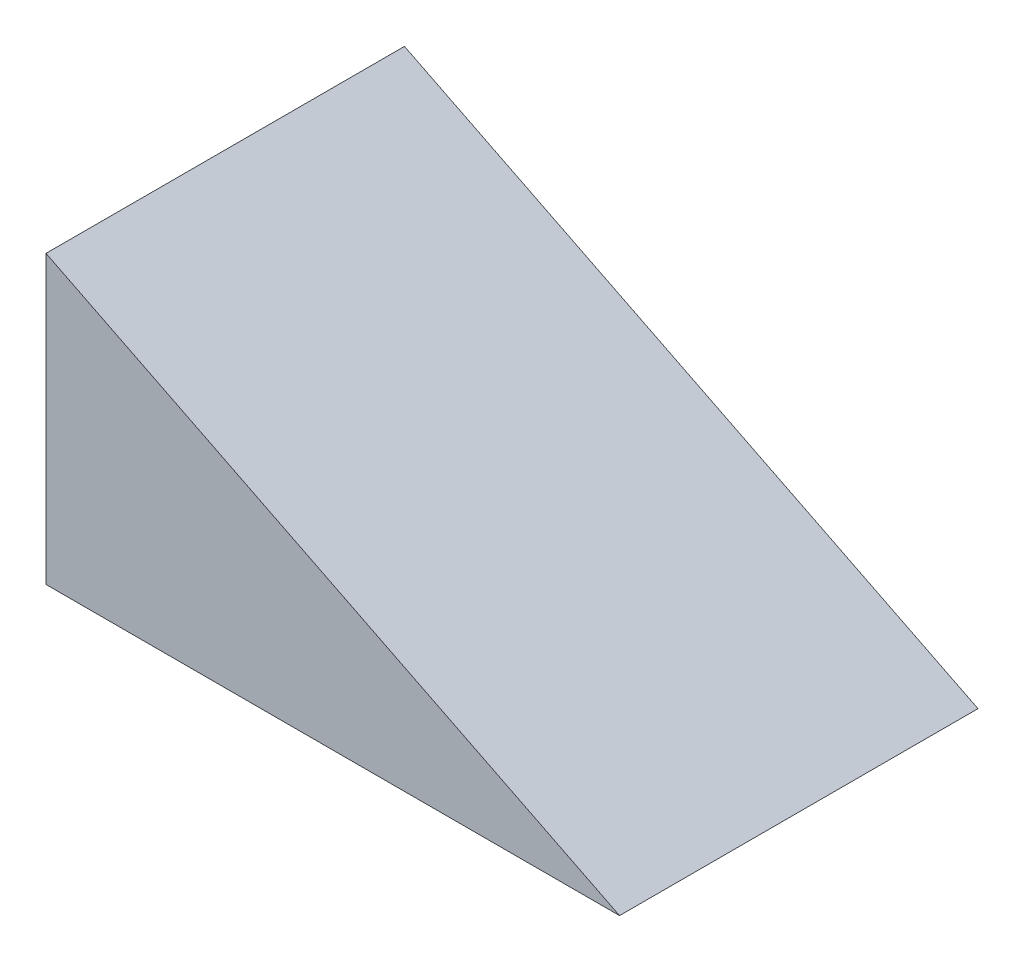
ISO-10303-21;
HEADER;
FILE_DESCRIPTION(('STEP AP214'),'2;1');
FILE_NAME('part.step','',(''),(''),'','','');
FILE_SCHEMA(('AUTOMOTIVE_DESIGN { 1 0 10303 214 1 1 1 1 }'));
ENDSEC;
DATA;
#1=APPLICATION_CONTEXT('core data for automotive mechanical design processes');
#2=APPLICATION_PROTOCOL_DEFINITION('international standard','automotive_design',2000,#1);
#3=PRODUCT_CONTEXT('',#1,'mechanical');
#4=PRODUCT('Part','Part','',(#3));
#5=PRODUCT_RELATED_PRODUCT_CATEGORY('part','',(#4));
#6=PRODUCT_DEFINITION_FORMATION('','',#4);
#7=PRODUCT_DEFINITION_CONTEXT('part definition',#1,'design');
#8=PRODUCT_DEFINITION('design','',#6,#7);
#9=PRODUCT_DEFINITION_SHAPE('','',#8);
#10=(LENGTH_UNIT() NAMED_UNIT(*) SI_UNIT(.MILLI.,.METRE.));
#11=(NAMED_UNIT(*) PLANE_ANGLE_UNIT() SI_UNIT($,.RADIAN.));
#12=(NAMED_UNIT(*) SI_UNIT($,.STERADIAN.) SOLID_ANGLE_UNIT());
#13=UNCERTAINTY_MEASURE_WITH_UNIT(LENGTH_MEASURE(1.E-05),#10,'distance_accuracy_value','');
#14=(GEOMETRIC_REPRESENTATION_CONTEXT(3) GLOBAL_UNCERTAINTY_ASSIGNED_CONTEXT((#13)) GLOBAL_UNIT_ASSIGNED_CONTEXT((#10,
#11,#12)) REPRESENTATION_CONTEXT('',''));
#15=CARTESIAN_POINT('',(0.,0.,0.));
#16=DIRECTION('',(0.,0.,1.));
#17=DIRECTION('',(1.,0.,0.));
#18=AXIS2_PLACEMENT_3D('',#15,#16,#17);
#19=CARTESIAN_POINT('',(40.64,81.28,127.));
#20=DIRECTION('',(0.447213595499958,0.894427190999916,0.));
#21=DIRECTION('',(-0.894427190999916,0.447213595499958,0.));
#22=AXIS2_PLACEMENT_3D('',#19,#20,#21);
#23=PLANE('',#22);
#24=DIRECTION('',(0.894427190999916,-0.447213595499958,0.));
#25=VECTOR('',#24,1.);
#26=CARTESIAN_POINT('',(40.64,81.28,0.));
#27=LINE('',#26,#25);
#28=CARTESIAN_POINT('',(0.,101.6,0.));
#29=VERTEX_POINT('',#28);
#30=CARTESIAN_POINT('',(203.2,0.,0.));
#31=VERTEX_POINT('',#30);
#32=EDGE_CURVE('E72',#29,#31,#27,.T.);
#33=ORIENTED_EDGE('',*,*,#32,.F.);
#34=DIRECTION('',(0.,0.,-1.));
#35=VECTOR('',#34,1.);
#36=CARTESIAN_POINT('',(0.,101.6,127.));
#37=LINE('',#36,#35);
#38=CARTESIAN_POINT('',(0.,101.6,127.));
#39=VERTEX_POINT('',#38);
#40=EDGE_CURVE('E11',#39,#29,#37,.T.);
#41=ORIENTED_EDGE('',*,*,#40,.F.);
#42=DIRECTION('',(0.894427190999916,-0.447213595499958,0.));
#43=VECTOR('',#42,1.);
#44=CARTESIAN_POINT('',(40.64,81.28,127.));
#45=LINE('',#44,#43);
#46=CARTESIAN_POINT('',(203.2,0.,127.));
#47=VERTEX_POINT('',#46);
#48=EDGE_CURVE('E70',#39,#47,#45,.T.);
#49=ORIENTED_EDGE('',*,*,#48,.T.);
#50=DIRECTION('',(0.,0.,-1.));
#51=VECTOR('',#50,1.);
#52=CARTESIAN_POINT('',(203.2,0.,127.));
#53=LINE('',#52,#51);
#54=EDGE_CURVE('E68',#47,#31,#53,.T.);
#55=ORIENTED_EDGE('',*,*,#54,.T.);
#56=EDGE_LOOP('',(#33,#41,#49,#55));
#57=FACE_BOUND('',#56,.T.);
#58=ADVANCED_FACE('F35',(#57),#23,.T.);
#59=CARTESIAN_POINT('',(0.,0.,127.));
#60=DIRECTION('',(-1.,0.,0.));
#61=DIRECTION('',(0.,0.,1.));
#62=AXIS2_PLACEMENT_3D('',#59,#60,#61);
#63=PLANE('',#62);
#64=DIRECTION('',(0.,1.,0.));
#65=VECTOR('',#64,1.);
#66=CARTESIAN_POINT('',(0.,0.,0.));
#67=LINE('',#66,#65);
#68=CARTESIAN_POINT('',(0.,0.,0.));
#69=VERTEX_POINT('',#68);
#70=EDGE_CURVE('E86',#69,#29,#67,.T.);
#71=ORIENTED_EDGE('',*,*,#70,.F.);
#72=DIRECTION('',(0.,0.,-1.));
#73=VECTOR('',#72,1.);
#74=CARTESIAN_POINT('',(0.,0.,127.));
#75=LINE('',#74,#73);
#76=CARTESIAN_POINT('',(0.,0.,127.));
#77=VERTEX_POINT('',#76);
#78=EDGE_CURVE('E43',#77,#69,#75,.T.);
#79=ORIENTED_EDGE('',*,*,#78,.F.);
#80=DIRECTION('',(0.,1.,0.));
#81=VECTOR('',#80,1.);
#82=CARTESIAN_POINT('',(0.,0.,127.));
#83=LINE('',#82,#81);
#84=EDGE_CURVE('E78',#77,#39,#83,.T.);
#85=ORIENTED_EDGE('',*,*,#84,.T.);
#86=ORIENTED_EDGE('',*,*,#40,.T.);
#87=EDGE_LOOP('',(#71,#79,#85,#86));
#88=FACE_BOUND('',#87,.T.);
#89=ADVANCED_FACE('F81',(#88),#63,.T.);
#90=CARTESIAN_POINT('',(0.,0.,127.));
#91=DIRECTION('',(0.,1.,0.));
#92=DIRECTION('',(0.,0.,1.));
#93=AXIS2_PLACEMENT_3D('',#90,#91,#92);
#94=PLANE('',#93);
#95=DIRECTION('',(1.,0.,0.));
#96=VECTOR('',#95,1.);
#97=CARTESIAN_POINT('',(0.,0.,0.));
#98=LINE('',#97,#96);
#99=EDGE_CURVE('E79',#69,#31,#98,.T.);
#100=ORIENTED_EDGE('',*,*,#99,.T.);
#101=ORIENTED_EDGE('',*,*,#54,.F.);
#102=DIRECTION('',(1.,0.,0.));
#103=VECTOR('',#102,1.);
#104=CARTESIAN_POINT('',(0.,0.,127.));
#105=LINE('',#104,#103);
#106=EDGE_CURVE('E51',#77,#47,#105,.T.);
#107=ORIENTED_EDGE('',*,*,#106,.F.);
#108=ORIENTED_EDGE('',*,*,#78,.T.);
#109=EDGE_LOOP('',(#100,#101,#107,#108));
#110=FACE_BOUND('',#109,.T.);
#111=ADVANCED_FACE('F89',(#110),#94,.F.);
#112=CARTESIAN_POINT('',(0.,0.,127.));
#113=DIRECTION('',(0.,0.,1.));
#114=DIRECTION('',(1.,0.,0.));
#115=AXIS2_PLACEMENT_3D('',#112,#113,#114);
#116=PLANE('',#115);
#117=ORIENTED_EDGE('',*,*,#48,.F.);
#118=ORIENTED_EDGE('',*,*,#84,.F.);
#119=ORIENTED_EDGE('',*,*,#106,.T.);
#120=EDGE_LOOP('',(#117,#118,#119));
#121=FACE_BOUND('',#120,.T.);
#122=ADVANCED_FACE('F77',(#121),#116,.T.);
#123=CARTESIAN_POINT('',(0.,0.,0.));
#124=DIRECTION('',(0.,0.,1.));
#125=DIRECTION('',(1.,0.,0.));
#126=AXIS2_PLACEMENT_3D('',#123,#124,#125);
#127=PLANE('',#126);
#128=ORIENTED_EDGE('',*,*,#32,.T.);
#129=ORIENTED_EDGE('',*,*,#99,.F.);
#130=ORIENTED_EDGE('',*,*,#70,.T.);
#131=EDGE_LOOP('',(#128,#129,#130));
#132=FACE_BOUND('',#131,.T.);
#133=ADVANCED_FACE('F91',(#132),#127,.F.);
#134=CLOSED_SHELL('',(#58,#89,#111,#122,#133));
#135=MANIFOLD_SOLID_BREP('B2',#134);
#136=ADVANCED_BREP_SHAPE_REPRESENTATION('',(#18,#135),#14);
#137=SHAPE_DEFINITION_REPRESENTATION(#9,#136);
ENDSEC;
END-ISO-10303-21;
